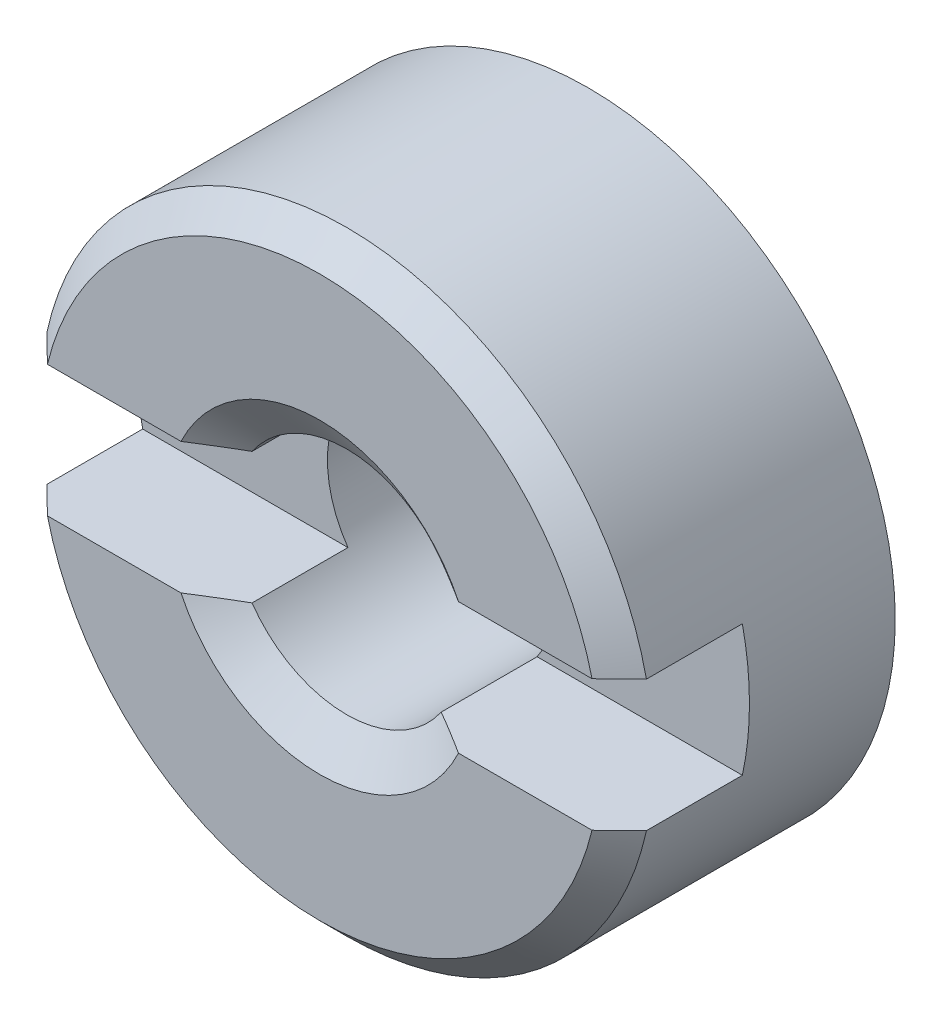
ISO-10303-21;
HEADER;
FILE_DESCRIPTION(('STEP AP214'),'2;1');
FILE_NAME('part.step','',(''),(''),'','','');
FILE_SCHEMA(('AUTOMOTIVE_DESIGN { 1 0 10303 214 1 1 1 1 }'));
ENDSEC;
DATA;
#1=APPLICATION_CONTEXT('core data for automotive mechanical design processes');
#2=APPLICATION_PROTOCOL_DEFINITION('international standard','automotive_design',2000,#1);
#3=PRODUCT_CONTEXT('',#1,'mechanical');
#4=PRODUCT('Part','Part','',(#3));
#5=PRODUCT_RELATED_PRODUCT_CATEGORY('part','',(#4));
#6=PRODUCT_DEFINITION_FORMATION('','',#4);
#7=PRODUCT_DEFINITION_CONTEXT('part definition',#1,'design');
#8=PRODUCT_DEFINITION('design','',#6,#7);
#9=PRODUCT_DEFINITION_SHAPE('','',#8);
#10=(LENGTH_UNIT() NAMED_UNIT(*) SI_UNIT(.MILLI.,.METRE.));
#11=(NAMED_UNIT(*) PLANE_ANGLE_UNIT() SI_UNIT($,.RADIAN.));
#12=(NAMED_UNIT(*) SI_UNIT($,.STERADIAN.) SOLID_ANGLE_UNIT());
#13=UNCERTAINTY_MEASURE_WITH_UNIT(LENGTH_MEASURE(1.E-05),#10,'distance_accuracy_value','');
#14=(GEOMETRIC_REPRESENTATION_CONTEXT(3) GLOBAL_UNCERTAINTY_ASSIGNED_CONTEXT((#13)) GLOBAL_UNIT_ASSIGNED_CONTEXT((#10,
#11,#12)) REPRESENTATION_CONTEXT('',''));
#15=CARTESIAN_POINT('',(0.,0.,0.));
#16=DIRECTION('',(0.,0.,1.));
#17=DIRECTION('',(1.,0.,0.));
#18=AXIS2_PLACEMENT_3D('',#15,#16,#17);
#19=CARTESIAN_POINT('',(0.,0.,0.));
#20=DIRECTION('',(0.,0.,1.));
#21=DIRECTION('',(1.,0.,0.));
#22=AXIS2_PLACEMENT_3D('',#19,#20,#21);
#23=PLANE('',#22);
#24=DIRECTION('',(1.,0.,0.));
#25=VECTOR('',#24,1.);
#26=CARTESIAN_POINT('',(-4.,-0.855000000000001,0.));
#27=LINE('',#26,#25);
#28=CARTESIAN_POINT('',(-3.54844684333865,-0.855000000000001,0.));
#29=VERTEX_POINT('',#28);
#30=CARTESIAN_POINT('',(-1.80803069664207,-0.855000000000001,0.));
#31=VERTEX_POINT('',#30);
#32=EDGE_CURVE('E293',#29,#31,#27,.T.);
#33=ORIENTED_EDGE('',*,*,#32,.F.);
#34=CARTESIAN_POINT('',(0.,0.,0.));
#35=DIRECTION('',(0.,0.,1.));
#36=DIRECTION('',(1.,0.,0.));
#37=AXIS2_PLACEMENT_3D('',#34,#35,#36);
#38=CIRCLE('',#37,3.65);
#39=CARTESIAN_POINT('',(3.54844684333865,-0.855000000000001,0.));
#40=VERTEX_POINT('',#39);
#41=EDGE_CURVE('E159',#29,#40,#38,.T.);
#42=ORIENTED_EDGE('',*,*,#41,.T.);
#43=CARTESIAN_POINT('',(1.80803069664207,-0.855000000000001,0.));
#44=VERTEX_POINT('',#43);
#45=EDGE_CURVE('E141',#44,#40,#27,.T.);
#46=ORIENTED_EDGE('',*,*,#45,.F.);
#47=CARTESIAN_POINT('',(0.,0.,0.));
#48=DIRECTION('',(0.,0.,1.));
#49=DIRECTION('',(1.,0.,0.));
#50=AXIS2_PLACEMENT_3D('',#47,#48,#49);
#51=CIRCLE('',#50,2.);
#52=EDGE_CURVE('E147',#31,#44,#51,.T.);
#53=ORIENTED_EDGE('',*,*,#52,.F.);
#54=EDGE_LOOP('',(#33,#42,#46,#53));
#55=FACE_BOUND('',#54,.T.);
#56=ADVANCED_FACE('F34',(#55),#23,.T.);
#57=CARTESIAN_POINT('',(0.,0.,-0.385114146015341));
#58=DIRECTION('',(0.,0.,1.));
#59=DIRECTION('',(1.,0.,0.));
#60=AXIS2_PLACEMENT_3D('',#57,#58,#59);
#61=CONICAL_SURFACE('',#60,1.45,0.959931088596881);
#62=CARTESIAN_POINT('',(-4.40937540948992,-0.855000000000002,1.74457053079125));
#63=CARTESIAN_POINT('',(-4.25360723353273,-0.855000000000001,1.63751142659845));
#64=CARTESIAN_POINT('',(-4.09775711801913,-0.855000000000001,1.53057062769733));
#65=CARTESIAN_POINT('',(-3.78577037098494,-0.855000000000001,1.31706999326997));
#66=CARTESIAN_POINT('',(-3.62963370904732,-0.855000000000001,1.21051020220773));
#67=CARTESIAN_POINT('',(-3.32079444988723,-0.855000000000001,1.00052931694203));
#68=CARTESIAN_POINT('',(-3.16810085129465,-0.855000000000001,0.897094997416638));
#69=CARTESIAN_POINT('',(-2.86219919332338,-0.855000000000001,0.691020083769624));
#70=CARTESIAN_POINT('',(-2.70899118507301,-0.855000000000001,0.58837941393002));
#71=CARTESIAN_POINT('',(-2.46315012123242,-0.855000000000001,0.425138581832778));
#72=CARTESIAN_POINT('',(-2.37078524289242,-0.855000000000001,0.364134948237008));
#73=CARTESIAN_POINT('',(-2.18564135703814,-0.855000000000001,0.242760425162767));
#74=CARTESIAN_POINT('',(-2.0928623532106,-0.855000000000001,0.182389530067293));
#75=CARTESIAN_POINT('',(-1.90509299151001,-0.855000000000001,0.061495444186396));
#76=CARTESIAN_POINT('',(-1.81009237477842,-0.855000000000001,0.000988126455904299));
#77=CARTESIAN_POINT('',(-1.61921586210381,-0.855000000000001,-0.1186201622502));
#78=CARTESIAN_POINT('',(-1.52334001554484,-0.855000000000001,-0.177721211902847));
#79=CARTESIAN_POINT('',(-1.32863387415344,-0.855000000000001,-0.294684297058959));
#80=CARTESIAN_POINT('',(-1.22978097197231,-0.855000000000001,-0.35250924843732));
#81=CARTESIAN_POINT('',(-1.0796375538443,-0.855000000000001,-0.436327032102085));
#82=CARTESIAN_POINT('',(-1.02919029532523,-0.855000000000001,-0.463824651872129));
#83=CARTESIAN_POINT('',(-0.927557408719823,-0.855000000000001,-0.517413909174926));
#84=CARTESIAN_POINT('',(-0.876371877672426,-0.855000000000001,-0.543505729389865));
#85=CARTESIAN_POINT('',(-0.774429779938969,-0.855000000000001,-0.59306129350701));
#86=CARTESIAN_POINT('',(-0.72369861030845,-0.855000000000001,-0.61657679845328));
#87=CARTESIAN_POINT('',(-0.621060689632918,-0.855000000000001,-0.661003784757138));
#88=CARTESIAN_POINT('',(-0.569153370933852,-0.855,-0.681913975629304));
#89=CARTESIAN_POINT('',(-0.464282549724176,-0.855,-0.719886493407521));
#90=CARTESIAN_POINT('',(-0.411327515234027,-0.855,-0.736971713344603));
#91=CARTESIAN_POINT('',(-0.304042454424557,-0.855,-0.765949746127141));
#92=CARTESIAN_POINT('',(-0.24971472429376,-0.855,-0.777850692014772));
#93=CARTESIAN_POINT('',(-0.155937132686888,-0.855,-0.792443009608285));
#94=CARTESIAN_POINT('',(-0.116749461288887,-0.855,-0.796805367300639));
#95=CARTESIAN_POINT('',(-0.0381121918903226,-0.855,-0.801769842573239));
#96=CARTESIAN_POINT('',(0.00133750342064276,-0.855,-0.802370474770308));
#97=CARTESIAN_POINT('',(0.0802103522771711,-0.855,-0.799744038962193));
#98=CARTESIAN_POINT('',(0.119633158088218,-0.855,-0.796506817427524));
#99=CARTESIAN_POINT('',(0.198016457261635,-0.855,-0.786485217754491));
#100=CARTESIAN_POINT('',(0.236976886667333,-0.855,-0.779700354616371));
#101=CARTESIAN_POINT('',(0.349917898002589,-0.855,-0.755440424711004));
#102=CARTESIAN_POINT('',(0.42301252933576,-0.855,-0.733879419329189));
#103=CARTESIAN_POINT('',(0.566671600174005,-0.855,-0.683518087898412));
#104=CARTESIAN_POINT('',(0.637230064305437,-0.855000000000001,-0.654701801552888));
#105=CARTESIAN_POINT('',(0.777924745756693,-0.855000000000001,-0.591925925327923));
#106=CARTESIAN_POINT('',(0.848014415334963,-0.855000000000001,-0.557863794463078));
#107=CARTESIAN_POINT('',(0.951970371810795,-0.855000000000001,-0.504607871391134));
#108=CARTESIAN_POINT('',(0.986408855994111,-0.855000000000001,-0.486505119369382));
#109=CARTESIAN_POINT('',(1.05496676085683,-0.855000000000001,-0.449705830546412));
#110=CARTESIAN_POINT('',(1.08908619119891,-0.855000000000001,-0.431009311803547));
#111=CARTESIAN_POINT('',(1.19991214023328,-0.855000000000001,-0.369269542653143));
#112=CARTESIAN_POINT('',(1.27607417864638,-0.855000000000001,-0.325251000063369));
#113=CARTESIAN_POINT('',(1.4274755154549,-0.855000000000001,-0.235650265125714));
#114=CARTESIAN_POINT('',(1.50271470893813,-0.855000000000001,-0.190067897192906));
#115=CARTESIAN_POINT('',(1.65255851420524,-0.855000000000001,-0.0978219648296624));
#116=CARTESIAN_POINT('',(1.72716291867817,-0.855000000000001,-0.0511580644191757));
#117=CARTESIAN_POINT('',(1.87589265107566,-0.855000000000001,0.0429281131555876));
#118=CARTESIAN_POINT('',(1.95001796932676,-0.855000000000001,0.0903504055661783));
#119=CARTESIAN_POINT('',(2.17208557089401,-0.855000000000001,0.233578823634761));
#120=CARTESIAN_POINT('',(2.31949672009639,-0.855000000000001,0.330207422231039));
#121=CARTESIAN_POINT('',(2.61345746384908,-0.855000000000001,0.524698771040903));
#122=CARTESIAN_POINT('',(2.76000721878243,-0.855000000000001,0.622561280105509));
#123=CARTESIAN_POINT('',(3.03223995396795,-0.855000000000001,0.805432717095454));
#124=CARTESIAN_POINT('',(3.15799261317164,-0.855000000000001,0.890337986010807));
#125=CARTESIAN_POINT('',(3.40922033580756,-0.855000000000001,1.06057383274946));
#126=CARTESIAN_POINT('',(3.53469538232667,-0.855000000000001,1.14590443550847));
#127=CARTESIAN_POINT('',(3.78513117202134,-0.855000000000001,1.31666361496756));
#128=CARTESIAN_POINT('',(3.9100924234606,-0.855000000000001,1.40209144665228));
#129=CARTESIAN_POINT('',(4.15984639839431,-0.855000000000001,1.57317575820644));
#130=CARTESIAN_POINT('',(4.28463913232119,-0.855000000000002,1.65883222284326));
#131=CARTESIAN_POINT('',(4.40937540948992,-0.855000000000002,1.74457053079125));
#132=B_SPLINE_CURVE_WITH_KNOTS('',3,(#62,#63,#64,#65,#66,#67,#68,#69,#70,#71,#72,#73,#74,#75,
#76,#77,#78,#79,#80,#81,#82,#83,#84,#85,#86,#87,#88,#89,#90,#91,#92,#93,#94,#95,#96,#97,#98,#99,
#100,#101,#102,#103,#104,#105,#106,#107,#108,#109,#110,#111,#112,#113,#114,#115,#116,#117,#118,
#119,#120,#121,#122,#123,#124,#125,#126,#127,#128,#129,#130,#131),.UNSPECIFIED.,.F.,.F.,(4,2,2,
2,2,2,2,2,2,2,2,2,2,2,2,2,2,2,2,2,2,2,2,2,2,2,2,2,2,2,2,2,2,2,4),(0.,0.567035491735846,
1.13413512790418,1.68742029137296,2.24065200083389,2.57272607055597,2.90479718985839,
3.24268795496059,3.58055977129311,3.92406456701395,4.09641350884743,4.26873999982885,
4.43643848851856,4.60421971552451,4.77096817475376,4.93745409008088,5.05558103376339,
5.17375461899859,5.29224154642083,5.41074467648363,5.63868407274298,5.86712934340679,
6.10079829833684,6.2175150737981,6.33422830292031,6.5980975120766,6.86199644582381,
7.12597848919678,7.38996584621393,7.91872833667408,8.44738904280907,8.90258413908276,
9.35780624317806,9.81191943433318,10.2660030900269),.UNSPECIFIED.);
#133=CARTESIAN_POINT('',(-1.23246703809879,-0.855000000000001,-0.350103769104855));
#134=VERTEX_POINT('',#133);
#135=EDGE_CURVE('E220',#31,#134,#132,.T.);
#136=ORIENTED_EDGE('',*,*,#135,.F.);
#137=ORIENTED_EDGE('',*,*,#52,.T.);
#138=CARTESIAN_POINT('',(1.23246703809879,-0.855000000000001,-0.350103769104855));
#139=VERTEX_POINT('',#138);
#140=EDGE_CURVE('E212',#139,#44,#132,.T.);
#141=ORIENTED_EDGE('',*,*,#140,.F.);
#142=CARTESIAN_POINT('',(0.,0.,-0.350103769104855));
#143=DIRECTION('',(0.,0.,1.));
#144=DIRECTION('',(1.,0.,0.));
#145=AXIS2_PLACEMENT_3D('',#142,#143,#144);
#146=CIRCLE('',#145,1.5);
#147=EDGE_CURVE('E149',#139,#134,#146,.F.);
#148=ORIENTED_EDGE('',*,*,#147,.T.);
#149=EDGE_LOOP('',(#136,#137,#141,#148));
#150=FACE_BOUND('',#149,.T.);
#151=ADVANCED_FACE('F206',(#150),#61,.F.);
#152=CARTESIAN_POINT('',(0.,0.,0.));
#153=DIRECTION('',(0.,0.,-1.));
#154=DIRECTION('',(-1.,0.,0.));
#155=AXIS2_PLACEMENT_3D('',#152,#153,#154);
#156=CONICAL_SURFACE('',#155,3.65,0.785398163397448);
#157=CARTESIAN_POINT('',(-8.76318031926663,-0.854999999999999,-5.15479155392006));
#158=CARTESIAN_POINT('',(-8.49402061428304,-0.854999999999999,-4.88691027304008));
#159=CARTESIAN_POINT('',(-8.22480880463004,-0.854999999999999,-4.61908130122699));
#160=CARTESIAN_POINT('',(-7.68620112321267,-0.854999999999999,-4.08355401027781));
#161=CARTESIAN_POINT('',(-7.41680523558475,-0.854999999999999,-3.81585570709758));
#162=CARTESIAN_POINT('',(-6.8770905896397,-0.854999999999999,-3.27996166632313));
#163=CARTESIAN_POINT('',(-6.60677127606832,-0.855,-3.01176648773734));
#164=CARTESIAN_POINT('',(-6.06585504879298,-0.855,-2.47571011870993));
#165=CARTESIAN_POINT('',(-5.79525816538501,-0.855,-2.20784889769291));
#166=CARTESIAN_POINT('',(-5.18301951064268,-0.855,-1.6028005395123));
#167=CARTESIAN_POINT('',(-4.84124731020153,-0.855,-1.26574518126064));
#168=CARTESIAN_POINT('',(-4.32755683572287,-0.855,-0.761097215774482));
#169=CARTESIAN_POINT('',(-4.15612571981522,-0.855000000000001,-0.593008871807959));
#170=CARTESIAN_POINT('',(-3.81279848360293,-0.855000000000001,-0.257319524057412));
#171=CARTESIAN_POINT('',(-3.64090238009476,-0.855000000000001,-0.0897185031121651));
#172=CARTESIAN_POINT('',(-3.29679451668552,-0.855000000000001,0.244388684433758));
#173=CARTESIAN_POINT('',(-3.12458432017816,-0.855000000000001,0.41089646058725));
#174=CARTESIAN_POINT('',(-2.77905025370706,-0.855000000000001,0.742803744943051));
#175=CARTESIAN_POINT('',(-2.60572623619458,-0.855000000000001,0.908203100125669));
#176=CARTESIAN_POINT('',(-2.34437209470054,-0.855000000000001,1.15474649623354));
#177=CARTESIAN_POINT('',(-2.25705293841537,-0.855000000000001,1.23664354990116));
#178=CARTESIAN_POINT('',(-2.08175909281745,-0.855000000000001,1.39973233977753));
#179=CARTESIAN_POINT('',(-1.99378441251625,-0.855000000000001,1.48092408564911));
#180=CARTESIAN_POINT('',(-1.81692974296093,-0.855000000000001,1.64227781357141));
#181=CARTESIAN_POINT('',(-1.72804995581184,-0.855000000000002,1.72244001684926));
#182=CARTESIAN_POINT('',(-1.54894207893338,-0.855000000000002,1.88124062528745));
#183=CARTESIAN_POINT('',(-1.4587141082182,-0.855000000000002,1.95987916356184));
#184=CARTESIAN_POINT('',(-1.3307530954664,-0.855000000000002,2.06836833237391));
#185=CARTESIAN_POINT('',(-1.29390585339282,-0.855000000000002,2.09926296906199));
#186=CARTESIAN_POINT('',(-1.21978899061868,-0.855000000000002,2.16054595724451));
#187=CARTESIAN_POINT('',(-1.18251935086268,-0.855000000000002,2.19093428574412));
#188=CARTESIAN_POINT('',(-1.10739658192419,-0.855000000000002,2.25112677545126));
#189=CARTESIAN_POINT('',(-1.06954250001449,-0.855000000000002,2.28092975065189));
#190=CARTESIAN_POINT('',(-0.993196597959992,-0.855000000000002,2.33970603638918));
#191=CARTESIAN_POINT('',(-0.954704814193946,-0.855000000000002,2.36867939399723));
#192=CARTESIAN_POINT('',(-0.8774934466079,-0.855000000000002,2.42511823353636));
#193=CARTESIAN_POINT('',(-0.83878555098869,-0.855000000000002,2.45259963091954));
#194=CARTESIAN_POINT('',(-0.760400568810257,-0.855000000000002,2.50614082659669));
#195=CARTESIAN_POINT('',(-0.720723645156618,-0.855000000000002,2.53220086148982));
#196=CARTESIAN_POINT('',(-0.640252297223496,-0.855000000000002,2.58231166097291));
#197=CARTESIAN_POINT('',(-0.59946100972838,-0.855000000000002,2.60636742115976));
#198=CARTESIAN_POINT('',(-0.516402386339854,-0.855000000000002,2.65175816605198));
#199=CARTESIAN_POINT('',(-0.474136281436573,-0.855000000000002,2.67309535380343));
#200=CARTESIAN_POINT('',(-0.403789006580022,-0.855000000000002,2.70475797784072));
#201=CARTESIAN_POINT('',(-0.376231104074642,-0.855000000000002,2.71624075764238));
#202=CARTESIAN_POINT('',(-0.32038714586222,-0.855000000000002,2.73730940963764));
#203=CARTESIAN_POINT('',(-0.292101032679126,-0.855000000000002,2.74689513157875));
#204=CARTESIAN_POINT('',(-0.235017129388142,-0.855000000000002,2.76370454544134));
#205=CARTESIAN_POINT('',(-0.20622363254024,-0.855000000000002,2.77094260059852));
#206=CARTESIAN_POINT('',(-0.148094400878188,-0.855000000000002,2.78273518750381));
#207=CARTESIAN_POINT('',(-0.118758891580319,-0.855000000000002,2.78729081051119));
#208=CARTESIAN_POINT('',(-0.0593417296146099,-0.855000000000002,2.79345944660739));
#209=CARTESIAN_POINT('',(-0.0292554292420469,-0.855000000000002,2.79502872967542));
#210=CARTESIAN_POINT('',(0.0309120472511965,-0.855000000000002,2.79497046787193));
#211=CARTESIAN_POINT('',(0.0609932235651223,-0.855000000000002,2.7933431031873));
#212=CARTESIAN_POINT('',(0.120937151558157,-0.855000000000002,2.78700616403505));
#213=CARTESIAN_POINT('',(0.150798652779452,-0.855000000000002,2.78228499651603));
#214=CARTESIAN_POINT('',(0.209955348298498,-0.855000000000002,2.77007561062039));
#215=CARTESIAN_POINT('',(0.239250212920685,-0.855000000000002,2.76258582954048));
#216=CARTESIAN_POINT('',(0.308220982787604,-0.855000000000002,2.7419442751505));
#217=CARTESIAN_POINT('',(0.347574223997945,-0.855000000000002,2.72772263593709));
#218=CARTESIAN_POINT('',(0.424880017862211,-0.855000000000002,2.69590172212456));
#219=CARTESIAN_POINT('',(0.462831669307308,-0.855000000000002,2.67830031794961));
#220=CARTESIAN_POINT('',(0.537636958086556,-0.855000000000002,2.64052895593845));
#221=CARTESIAN_POINT('',(0.574484740802245,-0.855000000000002,2.62034755404268));
#222=CARTESIAN_POINT('',(0.647081777179847,-0.855000000000002,2.57814709353136));
#223=CARTESIAN_POINT('',(0.682831433428105,-0.855000000000002,2.55612871964381));
#224=CARTESIAN_POINT('',(0.759786357638908,-0.855000000000002,2.50663594418393));
#225=CARTESIAN_POINT('',(0.800817345022692,-0.855000000000002,2.47889218784478));
#226=CARTESIAN_POINT('',(0.881906540923906,-0.855000000000002,2.42201221639858));
#227=CARTESIAN_POINT('',(0.921964548825333,-0.855000000000002,2.39287571774031));
#228=CARTESIAN_POINT('',(1.04104951744871,-0.855000000000002,2.30389540039656));
#229=CARTESIAN_POINT('',(1.11892845991508,-0.855000000000002,2.24252026628879));
#230=CARTESIAN_POINT('',(1.27292018106045,-0.855000000000002,2.11723483751274));
#231=CARTESIAN_POINT('',(1.34902791817503,-0.855000000000002,2.0533184450132));
#232=CARTESIAN_POINT('',(1.49988541330941,-0.855000000000002,1.92397073883353));
#233=CARTESIAN_POINT('',(1.57463573460955,-0.855000000000002,1.85854008040169));
#234=CARTESIAN_POINT('',(1.72354199021691,-0.855000000000002,1.72634534202154));
#235=CARTESIAN_POINT('',(1.79769377728001,-0.855000000000001,1.65957661096644));
#236=CARTESIAN_POINT('',(1.94532913101064,-0.855000000000001,1.5252902815973));
#237=CARTESIAN_POINT('',(2.01881262704118,-0.855000000000001,1.45777260575768));
#238=CARTESIAN_POINT('',(2.16515653483148,-0.855000000000001,1.32230505615459));
#239=CARTESIAN_POINT('',(2.2380177686013,-0.855000000000001,1.25435606902188));
#240=CARTESIAN_POINT('',(2.3833533008831,-0.855000000000001,1.11805115544254));
#241=CARTESIAN_POINT('',(2.4558276131754,-0.855000000000001,1.04969524367454));
#242=CARTESIAN_POINT('',(2.6625154609166,-0.855000000000001,0.853905254596458));
#243=CARTESIAN_POINT('',(2.79636531654366,-0.855000000000001,0.726087425710609));
#244=CARTESIAN_POINT('',(3.06338963554391,-0.855000000000001,0.469747758481044));
#245=CARTESIAN_POINT('',(3.19656409391014,-0.855000000000001,0.341225914932869));
#246=CARTESIAN_POINT('',(3.59540215102601,-0.855000000000001,-0.0450636849650292));
#247=CARTESIAN_POINT('',(3.86037191847532,-0.855000000000001,-0.303547382780917));
#248=CARTESIAN_POINT('',(4.38953969914958,-0.855,-0.821720674004418));
#249=CARTESIAN_POINT('',(4.65373693179603,-0.855,-1.0814110624419));
#250=CARTESIAN_POINT('',(5.18152543267378,-0.855,-1.6013984507929));
#251=CARTESIAN_POINT('',(5.44511671046634,-0.855,-1.86169544100261));
#252=CARTESIAN_POINT('',(5.96366512785982,-0.855,-2.37452580965));
#253=CARTESIAN_POINT('',(6.21863421745388,-0.855,-2.62704711285231));
#254=CARTESIAN_POINT('',(6.7283209519697,-0.854999999999999,-3.13234598786289));
#255=CARTESIAN_POINT('',(6.98303859556815,-0.854999999999999,-3.38512356100583));
#256=CARTESIAN_POINT('',(7.49207066679798,-0.854999999999999,-3.89064016381704));
#257=CARTESIAN_POINT('',(7.74638525231455,-0.854999999999999,-4.14337903453653));
#258=CARTESIAN_POINT('',(8.25487565652337,-0.854999999999999,-4.64899340312161));
#259=CARTESIAN_POINT('',(8.5090514760086,-0.854999999999999,-4.90186890018966));
#260=CARTESIAN_POINT('',(8.76318031926663,-0.854999999999999,-5.15479155392006));
#261=B_SPLINE_CURVE_WITH_KNOTS('',3,(#157,#158,#159,#160,#161,#162,#163,#164,#165,#166,#167,
#168,#169,#170,#171,#172,#173,#174,#175,#176,#177,#178,#179,#180,#181,#182,#183,#184,#185,#186,
#187,#188,#189,#190,#191,#192,#193,#194,#195,#196,#197,#198,#199,#200,#201,#202,#203,#204,#205,
#206,#207,#208,#209,#210,#211,#212,#213,#214,#215,#216,#217,#218,#219,#220,#221,#222,#223,#224,
#225,#226,#227,#228,#229,#230,#231,#232,#233,#234,#235,#236,#237,#238,#239,#240,#241,#242,#243,
#244,#245,#246,#247,#248,#249,#250,#251,#252,#253,#254,#255,#256,#257,#258,#259,#260),
.UNSPECIFIED.,.F.,.F.,(4,2,2,2,2,2,2,2,2,2,2,2,2,2,2,2,2,2,2,2,2,2,2,2,2,2,2,2,2,2,2,2,2,2,2,2,
2,2,2,2,2,2,2,2,2,2,2,2,2,2,2,4),(0.,1.13923923054452,2.27859369559239,3.42096410618851,
4.56322085589739,6.00326384239687,6.7235277335533,7.4437659455265,8.16239492880238,
8.88112115686805,9.2402646942934,9.59940330360795,9.95846340501038,10.3174919946045,
10.4617445224732,10.6060035840497,10.7505297927112,10.8950477848362,11.0374390407096,
11.1798065214228,11.3218078219225,11.463693307031,11.5532020882119,11.6427179559133,
11.7316753478571,11.8205965253649,11.9108100778125,12.0010185452978,12.0915669885165,
12.1821666187095,12.3074761838829,12.4328649667348,12.558830598344,12.6847494844938,
12.8332997902736,12.981880469607,13.2792544461396,13.5773910456571,13.8754009633586,
14.1747422195295,14.4741147560781,14.772998049057,15.0718706252446,15.6270944961124,
16.1823224770501,17.2928137485097,18.4041874568882,19.5155435070226,20.592105526501,
21.6686731818827,22.7443011323977,23.8199228704589),.UNSPECIFIED.);
#262=CARTESIAN_POINT('',(-3.90755358248611,-0.855000000000001,-0.350000000000001));
#263=VERTEX_POINT('',#262);
#264=EDGE_CURVE('E300',#263,#29,#261,.T.);
#265=ORIENTED_EDGE('',*,*,#264,.F.);
#266=CARTESIAN_POINT('',(0.,0.,-0.350000000000001));
#267=DIRECTION('',(0.,0.,1.));
#268=DIRECTION('',(1.,0.,0.));
#269=AXIS2_PLACEMENT_3D('',#266,#267,#268);
#270=CIRCLE('',#269,4.);
#271=CARTESIAN_POINT('',(3.90755358248611,-0.855000000000001,-0.350000000000004));
#272=VERTEX_POINT('',#271);
#273=EDGE_CURVE('E171',#272,#263,#270,.F.);
#274=ORIENTED_EDGE('',*,*,#273,.F.);
#275=EDGE_CURVE('E178',#40,#272,#261,.T.);
#276=ORIENTED_EDGE('',*,*,#275,.F.);
#277=ORIENTED_EDGE('',*,*,#41,.F.);
#278=EDGE_LOOP('',(#265,#274,#276,#277));
#279=FACE_BOUND('',#278,.T.);
#280=ADVANCED_FACE('F243',(#279),#156,.T.);
#281=CARTESIAN_POINT('',(0.,0.,-3.5));
#282=DIRECTION('',(0.,0.,1.));
#283=DIRECTION('',(1.,0.,0.));
#284=AXIS2_PLACEMENT_3D('',#281,#282,#283);
#285=CYLINDRICAL_SURFACE('',#284,1.5);
#286=CARTESIAN_POINT('',(0.,0.,-1.6));
#287=DIRECTION('',(0.,0.,-1.));
#288=DIRECTION('',(-1.,0.,0.));
#289=AXIS2_PLACEMENT_3D('',#286,#287,#288);
#290=CIRCLE('',#289,1.5);
#291=CARTESIAN_POINT('',(-1.23246703809879,0.855,-1.6));
#292=VERTEX_POINT('',#291);
#293=CARTESIAN_POINT('',(-1.23246703809879,-0.855,-1.6));
#294=VERTEX_POINT('',#293);
#295=EDGE_CURVE('E226',#292,#294,#290,.F.);
#296=ORIENTED_EDGE('',*,*,#295,.T.);
#297=DIRECTION('',(0.,0.,1.));
#298=VECTOR('',#297,1.);
#299=CARTESIAN_POINT('',(-1.23246703809879,-0.854999999999999,-3.5));
#300=LINE('',#299,#298);
#301=EDGE_CURVE('E224',#294,#134,#300,.T.);
#302=ORIENTED_EDGE('',*,*,#301,.T.);
#303=ORIENTED_EDGE('',*,*,#147,.F.);
#304=DIRECTION('',(0.,0.,1.));
#305=VECTOR('',#304,1.);
#306=CARTESIAN_POINT('',(1.23246703809879,-0.854999999999999,-3.5));
#307=LINE('',#306,#305);
#308=CARTESIAN_POINT('',(1.23246703809879,-0.855,-1.6));
#309=VERTEX_POINT('',#308);
#310=EDGE_CURVE('E218',#139,#309,#307,.F.);
#311=ORIENTED_EDGE('',*,*,#310,.T.);
#312=CARTESIAN_POINT('',(1.23246703809879,0.855,-1.6));
#313=VERTEX_POINT('',#312);
#314=EDGE_CURVE('E228',#309,#313,#290,.F.);
#315=ORIENTED_EDGE('',*,*,#314,.T.);
#316=DIRECTION('',(0.,0.,1.));
#317=VECTOR('',#316,1.);
#318=CARTESIAN_POINT('',(1.23246703809879,0.855,-3.5));
#319=LINE('',#318,#317);
#320=CARTESIAN_POINT('',(1.23246703809879,0.855,-0.350103769104855));
#321=VERTEX_POINT('',#320);
#322=EDGE_CURVE('E314',#313,#321,#319,.T.);
#323=ORIENTED_EDGE('',*,*,#322,.T.);
#324=CARTESIAN_POINT('',(-1.23246703809879,0.855,-0.350103769104855));
#325=VERTEX_POINT('',#324);
#326=EDGE_CURVE('E146',#325,#321,#146,.F.);
#327=ORIENTED_EDGE('',*,*,#326,.F.);
#328=DIRECTION('',(0.,0.,1.));
#329=VECTOR('',#328,1.);
#330=CARTESIAN_POINT('',(-1.23246703809879,0.855,-3.5));
#331=LINE('',#330,#329);
#332=EDGE_CURVE('E126',#325,#292,#331,.F.);
#333=ORIENTED_EDGE('',*,*,#332,.T.);
#334=EDGE_LOOP('',(#296,#302,#303,#311,#315,#323,#327,#333));
#335=FACE_BOUND('',#334,.T.);
#336=CARTESIAN_POINT('',(0.,0.,-3.12449623089514));
#337=DIRECTION('',(0.,0.,-1.));
#338=DIRECTION('',(-1.,0.,0.));
#339=AXIS2_PLACEMENT_3D('',#336,#337,#338);
#340=CIRCLE('',#339,1.5);
#341=CARTESIAN_POINT('',(-1.5,0.,-3.12449623089514));
#342=VERTEX_POINT('',#341);
#343=EDGE_CURVE('E152',#342,#342,#340,.F.);
#344=ORIENTED_EDGE('',*,*,#343,.F.);
#345=EDGE_LOOP('',(#344));
#346=FACE_BOUND('',#345,.T.);
#347=ADVANCED_FACE('F208',(#335,#346),#285,.F.);
#348=CARTESIAN_POINT('',(0.,0.,-3.5));
#349=DIRECTION('',(0.,0.,1.));
#350=DIRECTION('',(1.,0.,0.));
#351=AXIS2_PLACEMENT_3D('',#348,#349,#350);
#352=CYLINDRICAL_SURFACE('',#351,4.);
#353=CARTESIAN_POINT('',(0.,0.,-1.6));
#354=DIRECTION('',(0.,0.,-1.));
#355=DIRECTION('',(-1.,0.,0.));
#356=AXIS2_PLACEMENT_3D('',#353,#354,#355);
#357=CIRCLE('',#356,4.);
#358=CARTESIAN_POINT('',(3.90755358248611,-0.855,-1.6));
#359=VERTEX_POINT('',#358);
#360=CARTESIAN_POINT('',(3.90755358248611,0.855,-1.6));
#361=VERTEX_POINT('',#360);
#362=EDGE_CURVE('E39',#359,#361,#357,.F.);
#363=ORIENTED_EDGE('',*,*,#362,.F.);
#364=DIRECTION('',(0.,0.,1.));
#365=VECTOR('',#364,1.);
#366=CARTESIAN_POINT('',(3.90755358248611,-0.854999999999999,-3.5));
#367=LINE('',#366,#365);
#368=EDGE_CURVE('E315',#272,#359,#367,.F.);
#369=ORIENTED_EDGE('',*,*,#368,.F.);
#370=ORIENTED_EDGE('',*,*,#273,.T.);
#371=DIRECTION('',(0.,0.,1.));
#372=VECTOR('',#371,1.);
#373=CARTESIAN_POINT('',(-3.90755358248611,-0.854999999999999,-3.5));
#374=LINE('',#373,#372);
#375=CARTESIAN_POINT('',(-3.90755358248611,-0.855,-1.6));
#376=VERTEX_POINT('',#375);
#377=EDGE_CURVE('E219',#376,#263,#374,.T.);
#378=ORIENTED_EDGE('',*,*,#377,.F.);
#379=CARTESIAN_POINT('',(-3.90755358248611,0.855,-1.6));
#380=VERTEX_POINT('',#379);
#381=EDGE_CURVE('E11',#380,#376,#357,.F.);
#382=ORIENTED_EDGE('',*,*,#381,.F.);
#383=DIRECTION('',(0.,0.,1.));
#384=VECTOR('',#383,1.);
#385=CARTESIAN_POINT('',(-3.90755358248611,0.855,-3.5));
#386=LINE('',#385,#384);
#387=CARTESIAN_POINT('',(-3.90755358248611,0.855,-0.350000000000003));
#388=VERTEX_POINT('',#387);
#389=EDGE_CURVE('E282',#388,#380,#386,.F.);
#390=ORIENTED_EDGE('',*,*,#389,.F.);
#391=CARTESIAN_POINT('',(3.90755358248611,0.855,-0.350000000000001));
#392=VERTEX_POINT('',#391);
#393=EDGE_CURVE('E168',#388,#392,#270,.F.);
#394=ORIENTED_EDGE('',*,*,#393,.T.);
#395=DIRECTION('',(0.,0.,1.));
#396=VECTOR('',#395,1.);
#397=CARTESIAN_POINT('',(3.90755358248611,0.855,-3.5));
#398=LINE('',#397,#396);
#399=EDGE_CURVE('E58',#361,#392,#398,.T.);
#400=ORIENTED_EDGE('',*,*,#399,.F.);
#401=EDGE_LOOP('',(#363,#369,#370,#378,#382,#390,#394,#400));
#402=FACE_BOUND('',#401,.T.);
#403=CARTESIAN_POINT('',(0.,0.,-3.5));
#404=DIRECTION('',(0.,0.,1.));
#405=DIRECTION('',(1.,0.,0.));
#406=AXIS2_PLACEMENT_3D('',#403,#404,#405);
#407=CIRCLE('',#406,4.);
#408=CARTESIAN_POINT('',(4.,0.,-3.5));
#409=VERTEX_POINT('',#408);
#410=EDGE_CURVE('E157',#409,#409,#407,.T.);
#411=ORIENTED_EDGE('',*,*,#410,.T.);
#412=EDGE_LOOP('',(#411));
#413=FACE_BOUND('',#412,.T.);
#414=ADVANCED_FACE('F242',(#402,#413),#352,.T.);
#415=CARTESIAN_POINT('',(0.,0.,-3.5));
#416=DIRECTION('',(0.,0.,1.));
#417=DIRECTION('',(1.,0.,0.));
#418=AXIS2_PLACEMENT_3D('',#415,#416,#417);
#419=PLANE('',#418);
#420=CARTESIAN_POINT('',(0.,0.,-3.5));
#421=DIRECTION('',(0.,0.,1.));
#422=DIRECTION('',(1.,0.,0.));
#423=AXIS2_PLACEMENT_3D('',#420,#421,#422);
#424=CIRCLE('',#423,2.);
#425=CARTESIAN_POINT('',(2.,0.,-3.5));
#426=VERTEX_POINT('',#425);
#427=EDGE_CURVE('E162',#426,#426,#424,.F.);
#428=ORIENTED_EDGE('',*,*,#427,.F.);
#429=EDGE_LOOP('',(#428));
#430=FACE_BOUND('',#429,.T.);
#431=ORIENTED_EDGE('',*,*,#410,.F.);
#432=EDGE_LOOP('',(#431));
#433=FACE_BOUND('',#432,.T.);
#434=ADVANCED_FACE('F248',(#430,#433),#419,.F.);
#435=DIRECTION('',(1.,0.,0.));
#436=VECTOR('',#435,1.);
#437=CARTESIAN_POINT('',(-4.,0.855,0.));
#438=LINE('',#437,#436);
#439=CARTESIAN_POINT('',(1.80803069664207,0.855,0.));
#440=VERTEX_POINT('',#439);
#441=CARTESIAN_POINT('',(3.54844684333865,0.855,0.));
#442=VERTEX_POINT('',#441);
#443=EDGE_CURVE('E142',#440,#442,#438,.T.);
#444=ORIENTED_EDGE('',*,*,#443,.T.);
#445=CARTESIAN_POINT('',(-3.54844684333865,0.855,0.));
#446=VERTEX_POINT('',#445);
#447=EDGE_CURVE('E140',#442,#446,#38,.T.);
#448=ORIENTED_EDGE('',*,*,#447,.T.);
#449=CARTESIAN_POINT('',(-1.80803069664207,0.855,0.));
#450=VERTEX_POINT('',#449);
#451=EDGE_CURVE('E50',#446,#450,#438,.T.);
#452=ORIENTED_EDGE('',*,*,#451,.T.);
#453=EDGE_CURVE('E138',#440,#450,#51,.T.);
#454=ORIENTED_EDGE('',*,*,#453,.F.);
#455=EDGE_LOOP('',(#444,#448,#452,#454));
#456=FACE_BOUND('',#455,.T.);
#457=ADVANCED_FACE('F137',(#456),#23,.T.);
#458=CARTESIAN_POINT('',(4.40937540948992,0.855,1.74457053079125));
#459=CARTESIAN_POINT('',(4.25360723353273,0.855,1.63751142659845));
#460=CARTESIAN_POINT('',(4.09775711801913,0.855,1.53057062769733));
#461=CARTESIAN_POINT('',(3.78577037098494,0.855,1.31706999326997));
#462=CARTESIAN_POINT('',(3.62963370904732,0.855,1.21051020220773));
#463=CARTESIAN_POINT('',(3.32079444988723,0.855,1.00052931694203));
#464=CARTESIAN_POINT('',(3.16810085129465,0.855,0.897094997416638));
#465=CARTESIAN_POINT('',(2.86219919332338,0.855,0.691020083769624));
#466=CARTESIAN_POINT('',(2.70899118507301,0.855,0.58837941393002));
#467=CARTESIAN_POINT('',(2.46315012123242,0.855,0.425138581832778));
#468=CARTESIAN_POINT('',(2.37078524289242,0.855,0.364134948237008));
#469=CARTESIAN_POINT('',(2.18564135703814,0.855,0.242760425162768));
#470=CARTESIAN_POINT('',(2.0928623532106,0.855,0.182389530067293));
#471=CARTESIAN_POINT('',(1.90509299151001,0.855,0.0614954441863957));
#472=CARTESIAN_POINT('',(1.81009237477842,0.855,0.000988126455903798));
#473=CARTESIAN_POINT('',(1.61921586210381,0.855,-0.118620162250201));
#474=CARTESIAN_POINT('',(1.52334001554484,0.855,-0.177721211902848));
#475=CARTESIAN_POINT('',(1.32863387415344,0.855,-0.294684297058959));
#476=CARTESIAN_POINT('',(1.22978097197231,0.855,-0.35250924843732));
#477=CARTESIAN_POINT('',(1.0796375538443,0.855,-0.436327032102085));
#478=CARTESIAN_POINT('',(1.02919029532523,0.855,-0.463824651872129));
#479=CARTESIAN_POINT('',(0.927557408719823,0.855,-0.517413909174926));
#480=CARTESIAN_POINT('',(0.876371877672427,0.855,-0.543505729389865));
#481=CARTESIAN_POINT('',(0.77442977993897,0.855,-0.59306129350701));
#482=CARTESIAN_POINT('',(0.723698610308451,0.855,-0.61657679845328));
#483=CARTESIAN_POINT('',(0.62106068963292,0.855,-0.661003784757137));
#484=CARTESIAN_POINT('',(0.569153370933854,0.855,-0.681913975629304));
#485=CARTESIAN_POINT('',(0.464282549724177,0.855,-0.719886493407521));
#486=CARTESIAN_POINT('',(0.411327515234028,0.855,-0.736971713344603));
#487=CARTESIAN_POINT('',(0.304042454424558,0.855,-0.765949746127141));
#488=CARTESIAN_POINT('',(0.249714724293761,0.855,-0.777850692014773));
#489=CARTESIAN_POINT('',(0.155937132686889,0.855,-0.792443009608285));
#490=CARTESIAN_POINT('',(0.116749461288888,0.855,-0.796805367300639));
#491=CARTESIAN_POINT('',(0.0381121918903231,0.855,-0.801769842573239));
#492=CARTESIAN_POINT('',(-0.00133750342064244,0.855,-0.802370474770308));
#493=CARTESIAN_POINT('',(-0.0802103522771711,0.855,-0.799744038962193));
#494=CARTESIAN_POINT('',(-0.119633158088218,0.855,-0.796506817427525));
#495=CARTESIAN_POINT('',(-0.198016457261634,0.855,-0.786485217754492));
#496=CARTESIAN_POINT('',(-0.236976886667333,0.855,-0.779700354616371));
#497=CARTESIAN_POINT('',(-0.349917898002588,0.855,-0.755440424711005));
#498=CARTESIAN_POINT('',(-0.423012529335758,0.855,-0.73387941932919));
#499=CARTESIAN_POINT('',(-0.566671600174003,0.855,-0.683518087898413));
#500=CARTESIAN_POINT('',(-0.637230064305435,0.855,-0.654701801552889));
#501=CARTESIAN_POINT('',(-0.777924745756691,0.855,-0.591925925327924));
#502=CARTESIAN_POINT('',(-0.848014415334962,0.855,-0.557863794463079));
#503=CARTESIAN_POINT('',(-0.951970371810792,0.855,-0.504607871391136));
#504=CARTESIAN_POINT('',(-0.986408855994108,0.855,-0.486505119369384));
#505=CARTESIAN_POINT('',(-1.05496676085683,0.855,-0.449705830546414));
#506=CARTESIAN_POINT('',(-1.0890861911989,0.855,-0.431009311803548));
#507=CARTESIAN_POINT('',(-1.19991214023327,0.855,-0.369269542653144));
#508=CARTESIAN_POINT('',(-1.27607417864638,0.855,-0.325251000063371));
#509=CARTESIAN_POINT('',(-1.4274755154549,0.855,-0.235650265125716));
#510=CARTESIAN_POINT('',(-1.50271470893813,0.855,-0.190067897192908));
#511=CARTESIAN_POINT('',(-1.65255851420524,0.855,-0.0978219648296645));
#512=CARTESIAN_POINT('',(-1.72716291867817,0.855,-0.0511580644191777));
#513=CARTESIAN_POINT('',(-1.87589265107566,0.855,0.0429281131555858));
#514=CARTESIAN_POINT('',(-1.95001796932675,0.855,0.0903504055661767));
#515=CARTESIAN_POINT('',(-2.17208557089401,0.855,0.23357882363476));
#516=CARTESIAN_POINT('',(-2.31949672009639,0.855,0.330207422231038));
#517=CARTESIAN_POINT('',(-2.61345746384908,0.855,0.524698771040901));
#518=CARTESIAN_POINT('',(-2.76000721878243,0.855,0.622561280105507));
#519=CARTESIAN_POINT('',(-3.03223995396795,0.855,0.805432717095453));
#520=CARTESIAN_POINT('',(-3.15799261317164,0.855,0.890337986010807));
#521=CARTESIAN_POINT('',(-3.40922033580756,0.855,1.06057383274946));
#522=CARTESIAN_POINT('',(-3.53469538232667,0.855,1.14590443550847));
#523=CARTESIAN_POINT('',(-3.78513117202134,0.855,1.31666361496756));
#524=CARTESIAN_POINT('',(-3.9100924234606,0.855,1.40209144665228));
#525=CARTESIAN_POINT('',(-4.15984639839431,0.855,1.57317575820645));
#526=CARTESIAN_POINT('',(-4.28463913232119,0.855,1.65883222284326));
#527=CARTESIAN_POINT('',(-4.40937540948992,0.855,1.74457053079125));
#528=B_SPLINE_CURVE_WITH_KNOTS('',3,(#458,#459,#460,#461,#462,#463,#464,#465,#466,#467,#468,
#469,#470,#471,#472,#473,#474,#475,#476,#477,#478,#479,#480,#481,#482,#483,#484,#485,#486,#487,
#488,#489,#490,#491,#492,#493,#494,#495,#496,#497,#498,#499,#500,#501,#502,#503,#504,#505,#506,
#507,#508,#509,#510,#511,#512,#513,#514,#515,#516,#517,#518,#519,#520,#521,#522,#523,#524,#525,
#526,#527),.UNSPECIFIED.,.F.,.F.,(4,2,2,2,2,2,2,2,2,2,2,2,2,2,2,2,2,2,2,2,2,2,2,2,2,2,2,2,2,2,2,
2,2,2,4),(0.,0.567035491735846,1.13413512790418,1.68742029137296,2.24065200083389,
2.57272607055597,2.90479718985839,3.24268795496059,3.58055977129311,3.92406456701395,
4.09641350884743,4.26873999982885,4.43643848851856,4.60421971552451,4.77096817475376,
4.93745409008088,5.05558103376339,5.17375461899859,5.29224154642083,5.41074467648363,
5.63868407274298,5.86712934340679,6.10079829833684,6.21751507379809,6.33422830292031,
6.5980975120766,6.86199644582381,7.12597848919678,7.38996584621393,7.91872833667408,
8.44738904280907,8.90258413908276,9.35780624317806,9.81191943433319,10.2660030900269),.UNSPECIFIED.);
#529=EDGE_CURVE('E132',#440,#321,#528,.T.);
#530=ORIENTED_EDGE('',*,*,#529,.F.);
#531=ORIENTED_EDGE('',*,*,#453,.T.);
#532=EDGE_CURVE('E122',#325,#450,#528,.T.);
#533=ORIENTED_EDGE('',*,*,#532,.F.);
#534=ORIENTED_EDGE('',*,*,#326,.T.);
#535=EDGE_LOOP('',(#530,#531,#533,#534));
#536=FACE_BOUND('',#535,.T.);
#537=ADVANCED_FACE('F145',(#536),#61,.F.);
#538=CARTESIAN_POINT('',(0.,0.,-3.4746));
#539=DIRECTION('',(0.,0.,-1.));
#540=DIRECTION('',(-1.,0.,0.));
#541=AXIS2_PLACEMENT_3D('',#538,#539,#540);
#542=CONICAL_SURFACE('',#541,2.,0.95993108859688);
#543=CARTESIAN_POINT('',(0.,0.,-3.4746));
#544=DIRECTION('',(0.,0.,1.));
#545=DIRECTION('',(1.,0.,0.));
#546=AXIS2_PLACEMENT_3D('',#543,#544,#545);
#547=CIRCLE('',#546,2.);
#548=CARTESIAN_POINT('',(2.,0.,-3.4746));
#549=VERTEX_POINT('',#548);
#550=EDGE_CURVE('E155',#549,#549,#547,.T.);
#551=ORIENTED_EDGE('',*,*,#550,.F.);
#552=EDGE_LOOP('',(#551));
#553=FACE_BOUND('',#552,.T.);
#554=ORIENTED_EDGE('',*,*,#343,.T.);
#555=EDGE_LOOP('',(#554));
#556=FACE_BOUND('',#555,.T.);
#557=ADVANCED_FACE('F205',(#553,#556),#542,.F.);
#558=CARTESIAN_POINT('',(0.,0.,-25.0375057290932));
#559=DIRECTION('',(0.,0.,1.));
#560=DIRECTION('',(1.,0.,0.));
#561=AXIS2_PLACEMENT_3D('',#558,#559,#560);
#562=CYLINDRICAL_SURFACE('',#561,2.);
#563=ORIENTED_EDGE('',*,*,#550,.T.);
#564=EDGE_LOOP('',(#563));
#565=FACE_BOUND('',#564,.T.);
#566=ORIENTED_EDGE('',*,*,#427,.T.);
#567=EDGE_LOOP('',(#566));
#568=FACE_BOUND('',#567,.T.);
#569=ADVANCED_FACE('F207',(#565,#568),#562,.F.);
#570=CARTESIAN_POINT('',(8.76318031926663,0.855,-5.15479155392007));
#571=CARTESIAN_POINT('',(8.49402061428304,0.855,-4.88691027304009));
#572=CARTESIAN_POINT('',(8.22480880463005,0.855,-4.61908130122699));
#573=CARTESIAN_POINT('',(7.68620112321267,0.855,-4.08355401027782));
#574=CARTESIAN_POINT('',(7.41680523558476,0.855,-3.81585570709758));
#575=CARTESIAN_POINT('',(6.87709058963971,0.855,-3.27996166632314));
#576=CARTESIAN_POINT('',(6.60677127606833,0.855,-3.01176648773735));
#577=CARTESIAN_POINT('',(6.06585504879298,0.855,-2.47571011870994));
#578=CARTESIAN_POINT('',(5.79525816538502,0.855,-2.20784889769292));
#579=CARTESIAN_POINT('',(5.18301951064269,0.855,-1.60280053951231));
#580=CARTESIAN_POINT('',(4.84124731020154,0.855,-1.26574518126065));
#581=CARTESIAN_POINT('',(4.32755683572287,0.855,-0.761097215774488));
#582=CARTESIAN_POINT('',(4.15612571981522,0.855,-0.593008871807964));
#583=CARTESIAN_POINT('',(3.81279848360294,0.855,-0.257319524057416));
#584=CARTESIAN_POINT('',(3.64090238009476,0.855,-0.0897185031121686));
#585=CARTESIAN_POINT('',(3.29679451668552,0.855,0.244388684433756));
#586=CARTESIAN_POINT('',(3.12458432017816,0.855,0.410896460587249));
#587=CARTESIAN_POINT('',(2.77905025370706,0.855,0.742803744943051));
#588=CARTESIAN_POINT('',(2.60572623619458,0.855,0.908203100125669));
#589=CARTESIAN_POINT('',(2.34437209470054,0.855,1.15474649623354));
#590=CARTESIAN_POINT('',(2.25705293841537,0.855,1.23664354990116));
#591=CARTESIAN_POINT('',(2.08175909281745,0.855,1.39973233977753));
#592=CARTESIAN_POINT('',(1.99378441251625,0.855,1.48092408564911));
#593=CARTESIAN_POINT('',(1.81692974296093,0.855,1.64227781357141));
#594=CARTESIAN_POINT('',(1.72804995581184,0.855,1.72244001684927));
#595=CARTESIAN_POINT('',(1.54894207893337,0.855,1.88124062528746));
#596=CARTESIAN_POINT('',(1.4587141082182,0.855,1.95987916356184));
#597=CARTESIAN_POINT('',(1.33075309546639,0.855,2.06836833237392));
#598=CARTESIAN_POINT('',(1.29390585339282,0.855,2.099262969062));
#599=CARTESIAN_POINT('',(1.21978899061868,0.855,2.16054595724451));
#600=CARTESIAN_POINT('',(1.18251935086267,0.855,2.19093428574412));
#601=CARTESIAN_POINT('',(1.10739658192419,0.855,2.25112677545127));
#602=CARTESIAN_POINT('',(1.06954250001448,0.855,2.28092975065189));
#603=CARTESIAN_POINT('',(0.993196597959989,0.855,2.33970603638918));
#604=CARTESIAN_POINT('',(0.954704814193944,0.855,2.36867939399723));
#605=CARTESIAN_POINT('',(0.877493446607899,0.855,2.42511823353636));
#606=CARTESIAN_POINT('',(0.838785550988688,0.855,2.45259963091954));
#607=CARTESIAN_POINT('',(0.760400568810256,0.855,2.50614082659669));
#608=CARTESIAN_POINT('',(0.720723645156617,0.855,2.53220086148982));
#609=CARTESIAN_POINT('',(0.640252297223496,0.855,2.58231166097291));
#610=CARTESIAN_POINT('',(0.599461009728379,0.855,2.60636742115976));
#611=CARTESIAN_POINT('',(0.516402386339853,0.855,2.65175816605198));
#612=CARTESIAN_POINT('',(0.474136281436572,0.855,2.67309535380343));
#613=CARTESIAN_POINT('',(0.403789006580021,0.855,2.70475797784072));
#614=CARTESIAN_POINT('',(0.376231104074641,0.855,2.71624075764239));
#615=CARTESIAN_POINT('',(0.32038714586222,0.855,2.73730940963764));
#616=CARTESIAN_POINT('',(0.292101032679126,0.855,2.74689513157875));
#617=CARTESIAN_POINT('',(0.235017129388142,0.855,2.76370454544135));
#618=CARTESIAN_POINT('',(0.206223632540241,0.855,2.77094260059852));
#619=CARTESIAN_POINT('',(0.148094400878189,0.855,2.78273518750381));
#620=CARTESIAN_POINT('',(0.11875889158032,0.855,2.78729081051119));
#621=CARTESIAN_POINT('',(0.05934172961461,0.855,2.79345944660739));
#622=CARTESIAN_POINT('',(0.029255429242047,0.855,2.79502872967542));
#623=CARTESIAN_POINT('',(-0.0309120472511964,0.855,2.79497046787193));
#624=CARTESIAN_POINT('',(-0.0609932235651222,0.855,2.7933431031873));
#625=CARTESIAN_POINT('',(-0.120937151558157,0.855,2.78700616403505));
#626=CARTESIAN_POINT('',(-0.15079865277945,0.855,2.78228499651604));
#627=CARTESIAN_POINT('',(-0.209955348298496,0.855,2.77007561062039));
#628=CARTESIAN_POINT('',(-0.239250212920683,0.855,2.76258582954048));
#629=CARTESIAN_POINT('',(-0.308220982787601,0.855,2.74194427515051));
#630=CARTESIAN_POINT('',(-0.347574223997942,0.855,2.72772263593709));
#631=CARTESIAN_POINT('',(-0.424880017862207,0.855,2.69590172212456));
#632=CARTESIAN_POINT('',(-0.462831669307304,0.855,2.67830031794961));
#633=CARTESIAN_POINT('',(-0.537636958086551,0.855,2.64052895593846));
#634=CARTESIAN_POINT('',(-0.57448474080224,0.855,2.62034755404269));
#635=CARTESIAN_POINT('',(-0.647081777179842,0.855,2.57814709353136));
#636=CARTESIAN_POINT('',(-0.682831433428101,0.855,2.55612871964382));
#637=CARTESIAN_POINT('',(-0.759786357638904,0.855,2.50663594418394));
#638=CARTESIAN_POINT('',(-0.800817345022688,0.855,2.47889218784478));
#639=CARTESIAN_POINT('',(-0.881906540923902,0.855,2.42201221639858));
#640=CARTESIAN_POINT('',(-0.921964548825328,0.855,2.39287571774031));
#641=CARTESIAN_POINT('',(-1.0410495174487,0.855,2.30389540039656));
#642=CARTESIAN_POINT('',(-1.11892845991507,0.855,2.24252026628879));
#643=CARTESIAN_POINT('',(-1.27292018106045,0.855,2.11723483751275));
#644=CARTESIAN_POINT('',(-1.34902791817502,0.855,2.05331844501321));
#645=CARTESIAN_POINT('',(-1.4998854133094,0.855,1.92397073883354));
#646=CARTESIAN_POINT('',(-1.57463573460954,0.855,1.8585400804017));
#647=CARTESIAN_POINT('',(-1.7235419902169,0.855,1.72634534202155));
#648=CARTESIAN_POINT('',(-1.79769377727999,0.855,1.65957661096645));
#649=CARTESIAN_POINT('',(-1.94532913101063,0.855,1.52529028159731));
#650=CARTESIAN_POINT('',(-2.01881262704117,0.855,1.4577726057577));
#651=CARTESIAN_POINT('',(-2.16515653483147,0.855,1.3223050561546));
#652=CARTESIAN_POINT('',(-2.23801776860128,0.855,1.25435606902189));
#653=CARTESIAN_POINT('',(-2.38335330088309,0.855,1.11805115544256));
#654=CARTESIAN_POINT('',(-2.45582761317539,0.855,1.04969524367455));
#655=CARTESIAN_POINT('',(-2.66251546091658,0.855,0.853905254596471));
#656=CARTESIAN_POINT('',(-2.79636531654365,0.855,0.726087425710622));
#657=CARTESIAN_POINT('',(-3.06338963554389,0.855,0.469747758481055));
#658=CARTESIAN_POINT('',(-3.19656409391012,0.855,0.34122591493288));
#659=CARTESIAN_POINT('',(-3.595402151026,0.855,-0.0450636849650192));
#660=CARTESIAN_POINT('',(-3.86037191847531,0.855,-0.303547382780908));
#661=CARTESIAN_POINT('',(-4.38953969914958,0.855,-0.82172067400441));
#662=CARTESIAN_POINT('',(-4.65373693179603,0.855,-1.08141106244189));
#663=CARTESIAN_POINT('',(-5.18152543267377,0.855,-1.60139845079289));
#664=CARTESIAN_POINT('',(-5.44511671046634,0.855,-1.86169544100261));
#665=CARTESIAN_POINT('',(-5.96366512785982,0.855,-2.37452580965));
#666=CARTESIAN_POINT('',(-6.21863421745387,0.855,-2.62704711285231));
#667=CARTESIAN_POINT('',(-6.7283209519697,0.855,-3.13234598786289));
#668=CARTESIAN_POINT('',(-6.98303859556815,0.855,-3.38512356100583));
#669=CARTESIAN_POINT('',(-7.49207066679798,0.855,-3.89064016381704));
#670=CARTESIAN_POINT('',(-7.74638525231455,0.855,-4.14337903453653));
#671=CARTESIAN_POINT('',(-8.25487565652337,0.855,-4.64899340312162));
#672=CARTESIAN_POINT('',(-8.5090514760086,0.855,-4.90186890018966));
#673=CARTESIAN_POINT('',(-8.76318031926663,0.855,-5.15479155392006));
#674=B_SPLINE_CURVE_WITH_KNOTS('',3,(#570,#571,#572,#573,#574,#575,#576,#577,#578,#579,#580,
#581,#582,#583,#584,#585,#586,#587,#588,#589,#590,#591,#592,#593,#594,#595,#596,#597,#598,#599,
#600,#601,#602,#603,#604,#605,#606,#607,#608,#609,#610,#611,#612,#613,#614,#615,#616,#617,#618,
#619,#620,#621,#622,#623,#624,#625,#626,#627,#628,#629,#630,#631,#632,#633,#634,#635,#636,#637,
#638,#639,#640,#641,#642,#643,#644,#645,#646,#647,#648,#649,#650,#651,#652,#653,#654,#655,#656,
#657,#658,#659,#660,#661,#662,#663,#664,#665,#666,#667,#668,#669,#670,#671,#672,#673),
.UNSPECIFIED.,.F.,.F.,(4,2,2,2,2,2,2,2,2,2,2,2,2,2,2,2,2,2,2,2,2,2,2,2,2,2,2,2,2,2,2,2,2,2,2,2,
2,2,2,2,2,2,2,2,2,2,2,2,2,2,2,4),(0.,1.13923923054452,2.27859369559239,3.4209641061885,
4.56322085589738,6.00326384239686,6.7235277335533,7.4437659455265,8.16239492880239,
8.88112115686805,9.2402646942934,9.59940330360796,9.95846340501039,10.3174919946045,
10.4617445224732,10.6060035840497,10.7505297927112,10.8950477848362,11.0374390407096,
11.1798065214228,11.3218078219225,11.463693307031,11.5532020882119,11.6427179559133,
11.7316753478571,11.8205965253649,11.9108100778126,12.0010185452979,12.0915669885165,
12.1821666187095,12.3074761838829,12.4328649667348,12.558830598344,12.6847494844938,
12.8332997902736,12.981880469607,13.2792544461396,13.5773910456571,13.8754009633586,
14.1747422195295,14.4741147560781,14.772998049057,15.0718706252446,15.6270944961124,
16.1823224770501,17.2928137485097,18.4041874568882,19.5155435070226,20.592105526501,
21.6686731818827,22.7443011323977,23.8199228704589),.UNSPECIFIED.);
#675=EDGE_CURVE('E177',#392,#442,#674,.T.);
#676=ORIENTED_EDGE('',*,*,#675,.F.);
#677=ORIENTED_EDGE('',*,*,#393,.F.);
#678=EDGE_CURVE('E172',#446,#388,#674,.T.);
#679=ORIENTED_EDGE('',*,*,#678,.F.);
#680=ORIENTED_EDGE('',*,*,#447,.F.);
#681=EDGE_LOOP('',(#676,#677,#679,#680));
#682=FACE_BOUND('',#681,.T.);
#683=ADVANCED_FACE('F36',(#682),#156,.T.);
#684=CARTESIAN_POINT('',(-4.,-0.855,-1.6));
#685=DIRECTION('',(0.,-1.,0.));
#686=DIRECTION('',(0.,0.,-1.));
#687=AXIS2_PLACEMENT_3D('',#684,#685,#686);
#688=PLANE('',#687);
#689=DIRECTION('',(1.,0.,0.));
#690=VECTOR('',#689,1.);
#691=CARTESIAN_POINT('',(-4.,-0.855,-1.6));
#692=LINE('',#691,#690);
#693=EDGE_CURVE('E285',#376,#294,#692,.T.);
#694=ORIENTED_EDGE('',*,*,#693,.F.);
#695=ORIENTED_EDGE('',*,*,#377,.T.);
#696=ORIENTED_EDGE('',*,*,#264,.T.);
#697=ORIENTED_EDGE('',*,*,#32,.T.);
#698=ORIENTED_EDGE('',*,*,#135,.T.);
#699=ORIENTED_EDGE('',*,*,#301,.F.);
#700=EDGE_LOOP('',(#694,#695,#696,#697,#698,#699));
#701=FACE_BOUND('',#700,.T.);
#702=ADVANCED_FACE('F188',(#701),#688,.F.);
#703=CARTESIAN_POINT('',(-4.,0.855,0.));
#704=DIRECTION('',(0.,1.,0.));
#705=DIRECTION('',(0.,0.,1.));
#706=AXIS2_PLACEMENT_3D('',#703,#704,#705);
#707=PLANE('',#706);
#708=ORIENTED_EDGE('',*,*,#532,.T.);
#709=ORIENTED_EDGE('',*,*,#451,.F.);
#710=ORIENTED_EDGE('',*,*,#678,.T.);
#711=ORIENTED_EDGE('',*,*,#389,.T.);
#712=DIRECTION('',(1.,0.,0.));
#713=VECTOR('',#712,1.);
#714=CARTESIAN_POINT('',(-4.,0.855,-1.6));
#715=LINE('',#714,#713);
#716=EDGE_CURVE('E291',#380,#292,#715,.T.);
#717=ORIENTED_EDGE('',*,*,#716,.T.);
#718=ORIENTED_EDGE('',*,*,#332,.F.);
#719=EDGE_LOOP('',(#708,#709,#710,#711,#717,#718));
#720=FACE_BOUND('',#719,.T.);
#721=ADVANCED_FACE('F123',(#720),#707,.F.);
#722=CARTESIAN_POINT('',(-4.,0.855,-1.6));
#723=DIRECTION('',(0.,0.,-1.));
#724=DIRECTION('',(-1.,0.,0.));
#725=AXIS2_PLACEMENT_3D('',#722,#723,#724);
#726=PLANE('',#725);
#727=ORIENTED_EDGE('',*,*,#716,.F.);
#728=ORIENTED_EDGE('',*,*,#381,.T.);
#729=ORIENTED_EDGE('',*,*,#693,.T.);
#730=ORIENTED_EDGE('',*,*,#295,.F.);
#731=EDGE_LOOP('',(#727,#728,#729,#730));
#732=FACE_BOUND('',#731,.T.);
#733=ADVANCED_FACE('F317',(#732),#726,.F.);
#734=EDGE_CURVE('E287',#309,#359,#692,.T.);
#735=ORIENTED_EDGE('',*,*,#734,.T.);
#736=ORIENTED_EDGE('',*,*,#362,.T.);
#737=EDGE_CURVE('E290',#313,#361,#715,.T.);
#738=ORIENTED_EDGE('',*,*,#737,.F.);
#739=ORIENTED_EDGE('',*,*,#314,.F.);
#740=EDGE_LOOP('',(#735,#736,#738,#739));
#741=FACE_BOUND('',#740,.T.);
#742=ADVANCED_FACE('F190',(#741),#726,.F.);
#743=ORIENTED_EDGE('',*,*,#140,.T.);
#744=ORIENTED_EDGE('',*,*,#45,.T.);
#745=ORIENTED_EDGE('',*,*,#275,.T.);
#746=ORIENTED_EDGE('',*,*,#368,.T.);
#747=ORIENTED_EDGE('',*,*,#734,.F.);
#748=ORIENTED_EDGE('',*,*,#310,.F.);
#749=EDGE_LOOP('',(#743,#744,#745,#746,#747,#748));
#750=FACE_BOUND('',#749,.T.);
#751=ADVANCED_FACE('F187',(#750),#688,.F.);
#752=ORIENTED_EDGE('',*,*,#737,.T.);
#753=ORIENTED_EDGE('',*,*,#399,.T.);
#754=ORIENTED_EDGE('',*,*,#675,.T.);
#755=ORIENTED_EDGE('',*,*,#443,.F.);
#756=ORIENTED_EDGE('',*,*,#529,.T.);
#757=ORIENTED_EDGE('',*,*,#322,.F.);
#758=EDGE_LOOP('',(#752,#753,#754,#755,#756,#757));
#759=FACE_BOUND('',#758,.T.);
#760=ADVANCED_FACE('F183',(#759),#707,.F.);
#761=CLOSED_SHELL('',(#56,#151,#280,#347,#414,#434,#457,#537,#557,#569,#683,#702,#721,#733,#742,
#751,#760));
#762=MANIFOLD_SOLID_BREP('B2',#761);
#763=ADVANCED_BREP_SHAPE_REPRESENTATION('',(#18,#762),#14);
#764=SHAPE_DEFINITION_REPRESENTATION(#9,#763);
ENDSEC;
END-ISO-10303-21;
